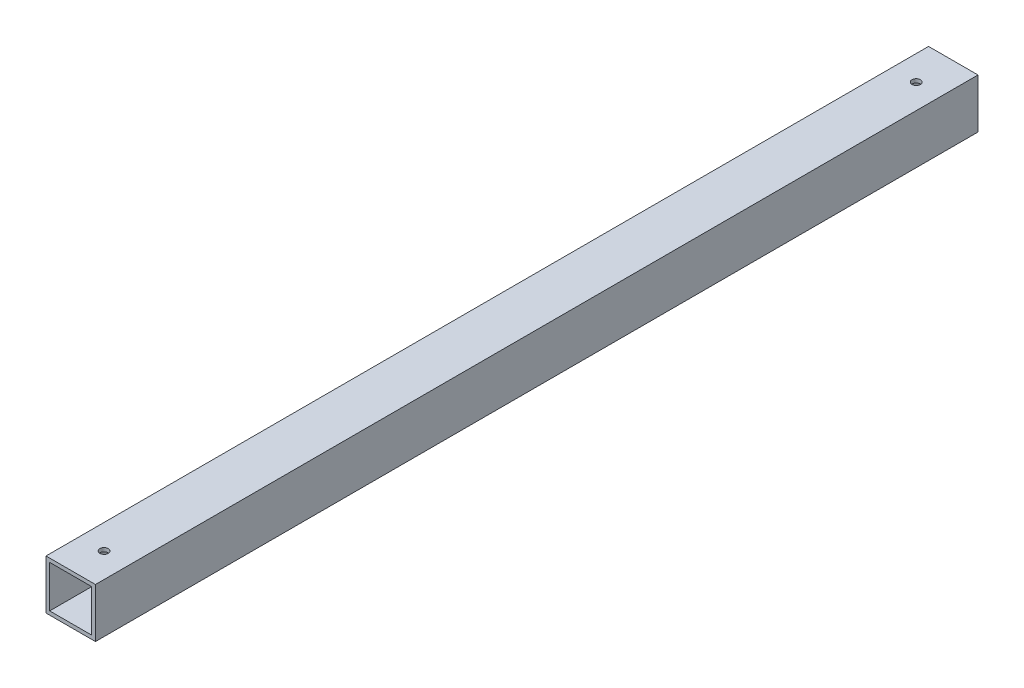
ISO-10303-21;
HEADER;
FILE_DESCRIPTION(('STEP AP214'),'2;1');
FILE_NAME('part.step','',(''),(''),'','','');
FILE_SCHEMA(('AUTOMOTIVE_DESIGN { 1 0 10303 214 1 1 1 1 }'));
ENDSEC;
DATA;
#1=APPLICATION_CONTEXT('core data for automotive mechanical design processes');
#2=APPLICATION_PROTOCOL_DEFINITION('international standard','automotive_design',2000,#1);
#3=PRODUCT_CONTEXT('',#1,'mechanical');
#4=PRODUCT('Part','Part','',(#3));
#5=PRODUCT_RELATED_PRODUCT_CATEGORY('part','',(#4));
#6=PRODUCT_DEFINITION_FORMATION('','',#4);
#7=PRODUCT_DEFINITION_CONTEXT('part definition',#1,'design');
#8=PRODUCT_DEFINITION('design','',#6,#7);
#9=PRODUCT_DEFINITION_SHAPE('','',#8);
#10=(LENGTH_UNIT() NAMED_UNIT(*) SI_UNIT(.MILLI.,.METRE.));
#11=(NAMED_UNIT(*) PLANE_ANGLE_UNIT() SI_UNIT($,.RADIAN.));
#12=(NAMED_UNIT(*) SI_UNIT($,.STERADIAN.) SOLID_ANGLE_UNIT());
#13=UNCERTAINTY_MEASURE_WITH_UNIT(LENGTH_MEASURE(1.E-05),#10,'distance_accuracy_value','');
#14=(GEOMETRIC_REPRESENTATION_CONTEXT(3) GLOBAL_UNCERTAINTY_ASSIGNED_CONTEXT((#13)) GLOBAL_UNIT_ASSIGNED_CONTEXT((#10,
#11,#12)) REPRESENTATION_CONTEXT('',''));
#15=CARTESIAN_POINT('',(0.,0.,0.));
#16=DIRECTION('',(0.,0.,1.));
#17=DIRECTION('',(1.,0.,0.));
#18=AXIS2_PLACEMENT_3D('',#15,#16,#17);
#19=CARTESIAN_POINT('',(0.,-20.,343.5));
#20=DIRECTION('',(0.,1.,0.));
#21=DIRECTION('',(1.,0.,0.));
#22=AXIS2_PLACEMENT_3D('',#19,#20,#21);
#23=CYLINDRICAL_SURFACE('',#22,1.7);
#24=DIRECTION('',(0.,1.,0.));
#25=VECTOR('',#24,1.);
#26=CARTESIAN_POINT('',(1.7,-20.,343.5));
#27=LINE('',#26,#25);
#28=CARTESIAN_POINT('',(1.7,8.5,343.5));
#29=VERTEX_POINT('',#28);
#30=CARTESIAN_POINT('',(1.7,10.,343.5));
#31=VERTEX_POINT('',#30);
#32=EDGE_CURVE('E9',#29,#31,#27,.T.);
#33=ORIENTED_EDGE('',*,*,#32,.F.);
#34=CARTESIAN_POINT('',(0.,8.5,343.5));
#35=DIRECTION('',(0.,1.,0.));
#36=DIRECTION('',(1.,0.,0.));
#37=AXIS2_PLACEMENT_3D('',#34,#35,#36);
#38=CIRCLE('',#37,1.7);
#39=EDGE_CURVE('E207',#29,#29,#38,.T.);
#40=ORIENTED_EDGE('',*,*,#39,.F.);
#41=ORIENTED_EDGE('',*,*,#32,.T.);
#42=CARTESIAN_POINT('',(0.,10.,343.5));
#43=DIRECTION('',(0.,1.,0.));
#44=DIRECTION('',(1.,0.,0.));
#45=AXIS2_PLACEMENT_3D('',#42,#43,#44);
#46=CIRCLE('',#45,1.7);
#47=EDGE_CURVE('E172',#31,#31,#46,.T.);
#48=ORIENTED_EDGE('',*,*,#47,.T.);
#49=EDGE_LOOP('',(#33,#40,#41,#48));
#50=FACE_BOUND('',#49,.T.);
#51=ADVANCED_FACE('F14',(#50),#23,.F.);
#52=CARTESIAN_POINT('',(0.,-20.,15.));
#53=DIRECTION('',(0.,1.,0.));
#54=DIRECTION('',(1.,0.,0.));
#55=AXIS2_PLACEMENT_3D('',#52,#53,#54);
#56=CYLINDRICAL_SURFACE('',#55,1.7);
#57=DIRECTION('',(0.,1.,0.));
#58=VECTOR('',#57,1.);
#59=CARTESIAN_POINT('',(1.7,-20.,15.));
#60=LINE('',#59,#58);
#61=CARTESIAN_POINT('',(1.7,8.5,15.));
#62=VERTEX_POINT('',#61);
#63=CARTESIAN_POINT('',(1.7,10.,15.));
#64=VERTEX_POINT('',#63);
#65=EDGE_CURVE('E24',#62,#64,#60,.T.);
#66=ORIENTED_EDGE('',*,*,#65,.F.);
#67=CARTESIAN_POINT('',(0.,8.5,15.));
#68=DIRECTION('',(0.,1.,0.));
#69=DIRECTION('',(1.,0.,0.));
#70=AXIS2_PLACEMENT_3D('',#67,#68,#69);
#71=CIRCLE('',#70,1.7);
#72=EDGE_CURVE('E219',#62,#62,#71,.T.);
#73=ORIENTED_EDGE('',*,*,#72,.F.);
#74=ORIENTED_EDGE('',*,*,#65,.T.);
#75=CARTESIAN_POINT('',(0.,10.,15.));
#76=DIRECTION('',(0.,1.,0.));
#77=DIRECTION('',(1.,0.,0.));
#78=AXIS2_PLACEMENT_3D('',#75,#76,#77);
#79=CIRCLE('',#78,1.7);
#80=EDGE_CURVE('E176',#64,#64,#79,.T.);
#81=ORIENTED_EDGE('',*,*,#80,.T.);
#82=EDGE_LOOP('',(#66,#73,#74,#81));
#83=FACE_BOUND('',#82,.T.);
#84=ADVANCED_FACE('F16',(#83),#56,.F.);
#85=CARTESIAN_POINT('',(-8.5,-8.5,-1.));
#86=DIRECTION('',(1.,0.,0.));
#87=DIRECTION('',(0.,1.,0.));
#88=AXIS2_PLACEMENT_3D('',#85,#86,#87);
#89=PLANE('',#88);
#90=DIRECTION('',(0.,0.,1.));
#91=VECTOR('',#90,1.);
#92=CARTESIAN_POINT('',(-8.5,-8.5,-1.));
#93=LINE('',#92,#91);
#94=CARTESIAN_POINT('',(-8.5,-8.5,0.));
#95=VERTEX_POINT('',#94);
#96=CARTESIAN_POINT('',(-8.5,-8.5,357.));
#97=VERTEX_POINT('',#96);
#98=EDGE_CURVE('E108',#95,#97,#93,.T.);
#99=ORIENTED_EDGE('',*,*,#98,.F.);
#100=DIRECTION('',(0.,1.,0.));
#101=VECTOR('',#100,1.);
#102=CARTESIAN_POINT('',(-8.5,-9.25,0.));
#103=LINE('',#102,#101);
#104=CARTESIAN_POINT('',(-8.5,8.5,0.));
#105=VERTEX_POINT('',#104);
#106=EDGE_CURVE('E112',#95,#105,#103,.T.);
#107=ORIENTED_EDGE('',*,*,#106,.T.);
#108=DIRECTION('',(0.,0.,1.));
#109=VECTOR('',#108,1.);
#110=CARTESIAN_POINT('',(-8.5,8.5,-1.));
#111=LINE('',#110,#109);
#112=CARTESIAN_POINT('',(-8.5,8.5,357.));
#113=VERTEX_POINT('',#112);
#114=EDGE_CURVE('E216',#105,#113,#111,.T.);
#115=ORIENTED_EDGE('',*,*,#114,.T.);
#116=DIRECTION('',(0.,1.,0.));
#117=VECTOR('',#116,1.);
#118=CARTESIAN_POINT('',(-8.5,-9.25,357.));
#119=LINE('',#118,#117);
#120=EDGE_CURVE('E115',#97,#113,#119,.T.);
#121=ORIENTED_EDGE('',*,*,#120,.F.);
#122=EDGE_LOOP('',(#99,#107,#115,#121));
#123=FACE_BOUND('',#122,.T.);
#124=ADVANCED_FACE('F110',(#123),#89,.T.);
#125=CARTESIAN_POINT('',(-8.5,8.5,-1.));
#126=DIRECTION('',(0.,1.,0.));
#127=DIRECTION('',(1.,0.,0.));
#128=AXIS2_PLACEMENT_3D('',#125,#126,#127);
#129=PLANE('',#128);
#130=ORIENTED_EDGE('',*,*,#39,.T.);
#131=EDGE_LOOP('',(#130));
#132=FACE_BOUND('',#131,.T.);
#133=ORIENTED_EDGE('',*,*,#72,.T.);
#134=EDGE_LOOP('',(#133));
#135=FACE_BOUND('',#134,.T.);
#136=DIRECTION('',(-1.,0.,0.));
#137=VECTOR('',#136,1.);
#138=CARTESIAN_POINT('',(-9.25,8.5,357.));
#139=LINE('',#138,#137);
#140=CARTESIAN_POINT('',(8.5,8.5,357.));
#141=VERTEX_POINT('',#140);
#142=EDGE_CURVE('E160',#141,#113,#139,.T.);
#143=ORIENTED_EDGE('',*,*,#142,.T.);
#144=ORIENTED_EDGE('',*,*,#114,.F.);
#145=DIRECTION('',(-1.,0.,0.));
#146=VECTOR('',#145,1.);
#147=CARTESIAN_POINT('',(-9.25,8.5,0.));
#148=LINE('',#147,#146);
#149=CARTESIAN_POINT('',(8.5,8.5,0.));
#150=VERTEX_POINT('',#149);
#151=EDGE_CURVE('E135',#150,#105,#148,.T.);
#152=ORIENTED_EDGE('',*,*,#151,.F.);
#153=DIRECTION('',(0.,0.,1.));
#154=VECTOR('',#153,1.);
#155=CARTESIAN_POINT('',(8.5,8.5,-1.));
#156=LINE('',#155,#154);
#157=EDGE_CURVE('E18',#150,#141,#156,.T.);
#158=ORIENTED_EDGE('',*,*,#157,.T.);
#159=EDGE_LOOP('',(#143,#144,#152,#158));
#160=FACE_BOUND('',#159,.T.);
#161=ADVANCED_FACE('F302',(#132,#135,#160),#129,.F.);
#162=CARTESIAN_POINT('',(8.5,-8.5,-1.));
#163=DIRECTION('',(1.,0.,0.));
#164=DIRECTION('',(0.,1.,0.));
#165=AXIS2_PLACEMENT_3D('',#162,#163,#164);
#166=PLANE('',#165);
#167=DIRECTION('',(0.,1.,0.));
#168=VECTOR('',#167,1.);
#169=CARTESIAN_POINT('',(8.5,-9.25,357.));
#170=LINE('',#169,#168);
#171=CARTESIAN_POINT('',(8.5,-8.5,357.));
#172=VERTEX_POINT('',#171);
#173=EDGE_CURVE('E164',#172,#141,#170,.T.);
#174=ORIENTED_EDGE('',*,*,#173,.T.);
#175=ORIENTED_EDGE('',*,*,#157,.F.);
#176=DIRECTION('',(0.,1.,0.));
#177=VECTOR('',#176,1.);
#178=CARTESIAN_POINT('',(8.5,-9.25,0.));
#179=LINE('',#178,#177);
#180=CARTESIAN_POINT('',(8.5,-8.5,0.));
#181=VERTEX_POINT('',#180);
#182=EDGE_CURVE('E142',#181,#150,#179,.T.);
#183=ORIENTED_EDGE('',*,*,#182,.F.);
#184=DIRECTION('',(0.,0.,1.));
#185=VECTOR('',#184,1.);
#186=CARTESIAN_POINT('',(8.5,-8.5,-1.));
#187=LINE('',#186,#185);
#188=EDGE_CURVE('E120',#181,#172,#187,.T.);
#189=ORIENTED_EDGE('',*,*,#188,.T.);
#190=EDGE_LOOP('',(#174,#175,#183,#189));
#191=FACE_BOUND('',#190,.T.);
#192=ADVANCED_FACE('F293',(#191),#166,.F.);
#193=CARTESIAN_POINT('',(-8.5,-8.5,-1.));
#194=DIRECTION('',(0.,1.,0.));
#195=DIRECTION('',(1.,0.,0.));
#196=AXIS2_PLACEMENT_3D('',#193,#194,#195);
#197=PLANE('',#196);
#198=CARTESIAN_POINT('',(0.,-8.5,343.5));
#199=DIRECTION('',(0.,1.,0.));
#200=DIRECTION('',(1.,0.,0.));
#201=AXIS2_PLACEMENT_3D('',#198,#199,#200);
#202=CIRCLE('',#201,1.7);
#203=CARTESIAN_POINT('',(1.7,-8.5,343.5));
#204=VERTEX_POINT('',#203);
#205=EDGE_CURVE('E146',#204,#204,#202,.T.);
#206=ORIENTED_EDGE('',*,*,#205,.F.);
#207=EDGE_LOOP('',(#206));
#208=FACE_BOUND('',#207,.T.);
#209=CARTESIAN_POINT('',(0.,-8.5,15.));
#210=DIRECTION('',(0.,1.,0.));
#211=DIRECTION('',(1.,0.,0.));
#212=AXIS2_PLACEMENT_3D('',#209,#210,#211);
#213=CIRCLE('',#212,1.7);
#214=CARTESIAN_POINT('',(1.7,-8.5,15.));
#215=VERTEX_POINT('',#214);
#216=EDGE_CURVE('E197',#215,#215,#213,.T.);
#217=ORIENTED_EDGE('',*,*,#216,.F.);
#218=EDGE_LOOP('',(#217));
#219=FACE_BOUND('',#218,.T.);
#220=ORIENTED_EDGE('',*,*,#188,.F.);
#221=DIRECTION('',(-1.,0.,0.));
#222=VECTOR('',#221,1.);
#223=CARTESIAN_POINT('',(-9.25,-8.5,0.));
#224=LINE('',#223,#222);
#225=EDGE_CURVE('E124',#181,#95,#224,.T.);
#226=ORIENTED_EDGE('',*,*,#225,.T.);
#227=ORIENTED_EDGE('',*,*,#98,.T.);
#228=DIRECTION('',(-1.,0.,0.));
#229=VECTOR('',#228,1.);
#230=CARTESIAN_POINT('',(-9.25,-8.5,357.));
#231=LINE('',#230,#229);
#232=EDGE_CURVE('E167',#172,#97,#231,.T.);
#233=ORIENTED_EDGE('',*,*,#232,.F.);
#234=EDGE_LOOP('',(#220,#226,#227,#233));
#235=FACE_BOUND('',#234,.T.);
#236=ADVANCED_FACE('F125',(#208,#219,#235),#197,.T.);
#237=CARTESIAN_POINT('',(0.,-20.,343.5));
#238=DIRECTION('',(0.,1.,0.));
#239=DIRECTION('',(1.,0.,0.));
#240=AXIS2_PLACEMENT_3D('',#237,#238,#239);
#241=CYLINDRICAL_SURFACE('',#240,1.7);
#242=DIRECTION('',(0.,1.,0.));
#243=VECTOR('',#242,1.);
#244=CARTESIAN_POINT('',(1.7,-20.,343.5));
#245=LINE('',#244,#243);
#246=CARTESIAN_POINT('',(1.7,-10.,343.5));
#247=VERTEX_POINT('',#246);
#248=EDGE_CURVE('E193',#247,#204,#245,.T.);
#249=ORIENTED_EDGE('',*,*,#248,.F.);
#250=CARTESIAN_POINT('',(0.,-10.,343.5));
#251=DIRECTION('',(0.,1.,0.));
#252=DIRECTION('',(1.,0.,0.));
#253=AXIS2_PLACEMENT_3D('',#250,#251,#252);
#254=CIRCLE('',#253,1.7);
#255=EDGE_CURVE('E153',#247,#247,#254,.T.);
#256=ORIENTED_EDGE('',*,*,#255,.F.);
#257=ORIENTED_EDGE('',*,*,#248,.T.);
#258=ORIENTED_EDGE('',*,*,#205,.T.);
#259=EDGE_LOOP('',(#249,#256,#257,#258));
#260=FACE_BOUND('',#259,.T.);
#261=ADVANCED_FACE('F279',(#260),#241,.F.);
#262=CARTESIAN_POINT('',(0.,-20.,15.));
#263=DIRECTION('',(0.,1.,0.));
#264=DIRECTION('',(1.,0.,0.));
#265=AXIS2_PLACEMENT_3D('',#262,#263,#264);
#266=CYLINDRICAL_SURFACE('',#265,1.7);
#267=DIRECTION('',(0.,1.,0.));
#268=VECTOR('',#267,1.);
#269=CARTESIAN_POINT('',(1.7,-20.,15.));
#270=LINE('',#269,#268);
#271=CARTESIAN_POINT('',(1.7,-10.,15.));
#272=VERTEX_POINT('',#271);
#273=EDGE_CURVE('E130',#272,#215,#270,.T.);
#274=ORIENTED_EDGE('',*,*,#273,.F.);
#275=CARTESIAN_POINT('',(0.,-10.,15.));
#276=DIRECTION('',(0.,1.,0.));
#277=DIRECTION('',(1.,0.,0.));
#278=AXIS2_PLACEMENT_3D('',#275,#276,#277);
#279=CIRCLE('',#278,1.7);
#280=EDGE_CURVE('E177',#272,#272,#279,.T.);
#281=ORIENTED_EDGE('',*,*,#280,.F.);
#282=ORIENTED_EDGE('',*,*,#273,.T.);
#283=ORIENTED_EDGE('',*,*,#216,.T.);
#284=EDGE_LOOP('',(#274,#281,#282,#283));
#285=FACE_BOUND('',#284,.T.);
#286=ADVANCED_FACE('F289',(#285),#266,.F.);
#287=CARTESIAN_POINT('',(10.,-10.,0.));
#288=DIRECTION('',(1.,0.,0.));
#289=DIRECTION('',(0.,1.,0.));
#290=AXIS2_PLACEMENT_3D('',#287,#288,#289);
#291=PLANE('',#290);
#292=DIRECTION('',(0.,0.,1.));
#293=VECTOR('',#292,1.);
#294=CARTESIAN_POINT('',(10.,-10.,0.));
#295=LINE('',#294,#293);
#296=CARTESIAN_POINT('',(10.,-10.,0.));
#297=VERTEX_POINT('',#296);
#298=CARTESIAN_POINT('',(10.,-10.,357.));
#299=VERTEX_POINT('',#298);
#300=EDGE_CURVE('E190',#297,#299,#295,.T.);
#301=ORIENTED_EDGE('',*,*,#300,.F.);
#302=DIRECTION('',(0.,1.,0.));
#303=VECTOR('',#302,1.);
#304=CARTESIAN_POINT('',(10.,-10.,0.));
#305=LINE('',#304,#303);
#306=CARTESIAN_POINT('',(10.,10.,0.));
#307=VERTEX_POINT('',#306);
#308=EDGE_CURVE('E175',#297,#307,#305,.T.);
#309=ORIENTED_EDGE('',*,*,#308,.T.);
#310=DIRECTION('',(0.,0.,1.));
#311=VECTOR('',#310,1.);
#312=CARTESIAN_POINT('',(10.,10.,0.));
#313=LINE('',#312,#311);
#314=CARTESIAN_POINT('',(10.,10.,357.));
#315=VERTEX_POINT('',#314);
#316=EDGE_CURVE('E184',#307,#315,#313,.T.);
#317=ORIENTED_EDGE('',*,*,#316,.T.);
#318=DIRECTION('',(0.,1.,0.));
#319=VECTOR('',#318,1.);
#320=CARTESIAN_POINT('',(10.,-10.,357.));
#321=LINE('',#320,#319);
#322=EDGE_CURVE('E148',#299,#315,#321,.T.);
#323=ORIENTED_EDGE('',*,*,#322,.F.);
#324=EDGE_LOOP('',(#301,#309,#317,#323));
#325=FACE_BOUND('',#324,.T.);
#326=ADVANCED_FACE('F251',(#325),#291,.T.);
#327=CARTESIAN_POINT('',(-10.,-10.,0.));
#328=DIRECTION('',(0.,0.,1.));
#329=DIRECTION('',(1.,0.,0.));
#330=AXIS2_PLACEMENT_3D('',#327,#328,#329);
#331=PLANE('',#330);
#332=ORIENTED_EDGE('',*,*,#182,.T.);
#333=ORIENTED_EDGE('',*,*,#151,.T.);
#334=ORIENTED_EDGE('',*,*,#106,.F.);
#335=ORIENTED_EDGE('',*,*,#225,.F.);
#336=EDGE_LOOP('',(#332,#333,#334,#335));
#337=FACE_BOUND('',#336,.T.);
#338=DIRECTION('',(1.,0.,0.));
#339=VECTOR('',#338,1.);
#340=CARTESIAN_POINT('',(-10.,10.,0.));
#341=LINE('',#340,#339);
#342=CARTESIAN_POINT('',(-10.,10.,0.));
#343=VERTEX_POINT('',#342);
#344=EDGE_CURVE('E171',#343,#307,#341,.T.);
#345=ORIENTED_EDGE('',*,*,#344,.T.);
#346=ORIENTED_EDGE('',*,*,#308,.F.);
#347=DIRECTION('',(1.,0.,0.));
#348=VECTOR('',#347,1.);
#349=CARTESIAN_POINT('',(-10.,-10.,0.));
#350=LINE('',#349,#348);
#351=CARTESIAN_POINT('',(-10.,-10.,0.));
#352=VERTEX_POINT('',#351);
#353=EDGE_CURVE('E180',#352,#297,#350,.T.);
#354=ORIENTED_EDGE('',*,*,#353,.F.);
#355=DIRECTION('',(0.,1.,0.));
#356=VECTOR('',#355,1.);
#357=CARTESIAN_POINT('',(-10.,-10.,0.));
#358=LINE('',#357,#356);
#359=EDGE_CURVE('E154',#352,#343,#358,.T.);
#360=ORIENTED_EDGE('',*,*,#359,.T.);
#361=EDGE_LOOP('',(#345,#346,#354,#360));
#362=FACE_BOUND('',#361,.T.);
#363=ADVANCED_FACE('F132',(#337,#362),#331,.F.);
#364=CARTESIAN_POINT('',(-10.,10.,0.));
#365=DIRECTION('',(0.,1.,0.));
#366=DIRECTION('',(1.,0.,0.));
#367=AXIS2_PLACEMENT_3D('',#364,#365,#366);
#368=PLANE('',#367);
#369=ORIENTED_EDGE('',*,*,#47,.F.);
#370=EDGE_LOOP('',(#369));
#371=FACE_BOUND('',#370,.T.);
#372=ORIENTED_EDGE('',*,*,#80,.F.);
#373=EDGE_LOOP('',(#372));
#374=FACE_BOUND('',#373,.T.);
#375=ORIENTED_EDGE('',*,*,#344,.F.);
#376=DIRECTION('',(0.,0.,1.));
#377=VECTOR('',#376,1.);
#378=CARTESIAN_POINT('',(-10.,10.,0.));
#379=LINE('',#378,#377);
#380=CARTESIAN_POINT('',(-10.,10.,357.));
#381=VERTEX_POINT('',#380);
#382=EDGE_CURVE('E159',#343,#381,#379,.T.);
#383=ORIENTED_EDGE('',*,*,#382,.T.);
#384=DIRECTION('',(1.,0.,0.));
#385=VECTOR('',#384,1.);
#386=CARTESIAN_POINT('',(-10.,10.,357.));
#387=LINE('',#386,#385);
#388=EDGE_CURVE('E152',#381,#315,#387,.T.);
#389=ORIENTED_EDGE('',*,*,#388,.T.);
#390=ORIENTED_EDGE('',*,*,#316,.F.);
#391=EDGE_LOOP('',(#375,#383,#389,#390));
#392=FACE_BOUND('',#391,.T.);
#393=ADVANCED_FACE('F316',(#371,#374,#392),#368,.T.);
#394=CARTESIAN_POINT('',(-10.,-10.,357.));
#395=DIRECTION('',(0.,0.,1.));
#396=DIRECTION('',(1.,0.,0.));
#397=AXIS2_PLACEMENT_3D('',#394,#395,#396);
#398=PLANE('',#397);
#399=ORIENTED_EDGE('',*,*,#232,.T.);
#400=ORIENTED_EDGE('',*,*,#120,.T.);
#401=ORIENTED_EDGE('',*,*,#142,.F.);
#402=ORIENTED_EDGE('',*,*,#173,.F.);
#403=EDGE_LOOP('',(#399,#400,#401,#402));
#404=FACE_BOUND('',#403,.T.);
#405=DIRECTION('',(0.,1.,0.));
#406=VECTOR('',#405,1.);
#407=CARTESIAN_POINT('',(-10.,-10.,357.));
#408=LINE('',#407,#406);
#409=CARTESIAN_POINT('',(-10.,-10.,357.));
#410=VERTEX_POINT('',#409);
#411=EDGE_CURVE('E225',#410,#381,#408,.T.);
#412=ORIENTED_EDGE('',*,*,#411,.F.);
#413=DIRECTION('',(1.,0.,0.));
#414=VECTOR('',#413,1.);
#415=CARTESIAN_POINT('',(-10.,-10.,357.));
#416=LINE('',#415,#414);
#417=EDGE_CURVE('E186',#410,#299,#416,.T.);
#418=ORIENTED_EDGE('',*,*,#417,.T.);
#419=ORIENTED_EDGE('',*,*,#322,.T.);
#420=ORIENTED_EDGE('',*,*,#388,.F.);
#421=EDGE_LOOP('',(#412,#418,#419,#420));
#422=FACE_BOUND('',#421,.T.);
#423=ADVANCED_FACE('F285',(#404,#422),#398,.T.);
#424=CARTESIAN_POINT('',(-10.,-10.,0.));
#425=DIRECTION('',(0.,1.,0.));
#426=DIRECTION('',(1.,0.,0.));
#427=AXIS2_PLACEMENT_3D('',#424,#425,#426);
#428=PLANE('',#427);
#429=ORIENTED_EDGE('',*,*,#255,.T.);
#430=EDGE_LOOP('',(#429));
#431=FACE_BOUND('',#430,.T.);
#432=ORIENTED_EDGE('',*,*,#280,.T.);
#433=EDGE_LOOP('',(#432));
#434=FACE_BOUND('',#433,.T.);
#435=ORIENTED_EDGE('',*,*,#300,.T.);
#436=ORIENTED_EDGE('',*,*,#417,.F.);
#437=DIRECTION('',(0.,0.,1.));
#438=VECTOR('',#437,1.);
#439=CARTESIAN_POINT('',(-10.,-10.,0.));
#440=LINE('',#439,#438);
#441=EDGE_CURVE('E158',#352,#410,#440,.T.);
#442=ORIENTED_EDGE('',*,*,#441,.F.);
#443=ORIENTED_EDGE('',*,*,#353,.T.);
#444=EDGE_LOOP('',(#435,#436,#442,#443));
#445=FACE_BOUND('',#444,.T.);
#446=ADVANCED_FACE('F244',(#431,#434,#445),#428,.F.);
#447=CARTESIAN_POINT('',(-10.,-10.,0.));
#448=DIRECTION('',(1.,0.,0.));
#449=DIRECTION('',(0.,1.,0.));
#450=AXIS2_PLACEMENT_3D('',#447,#448,#449);
#451=PLANE('',#450);
#452=ORIENTED_EDGE('',*,*,#411,.T.);
#453=ORIENTED_EDGE('',*,*,#382,.F.);
#454=ORIENTED_EDGE('',*,*,#359,.F.);
#455=ORIENTED_EDGE('',*,*,#441,.T.);
#456=EDGE_LOOP('',(#452,#453,#454,#455));
#457=FACE_BOUND('',#456,.T.);
#458=ADVANCED_FACE('F284',(#457),#451,.F.);
#459=CLOSED_SHELL('',(#51,#84,#124,#161,#192,#236,#261,#286,#326,#363,#393,#423,#446,#458));
#460=MANIFOLD_SOLID_BREP('B1',#459);
#461=ADVANCED_BREP_SHAPE_REPRESENTATION('',(#18,#460),#14);
#462=SHAPE_DEFINITION_REPRESENTATION(#9,#461);
ENDSEC;
END-ISO-10303-21;
